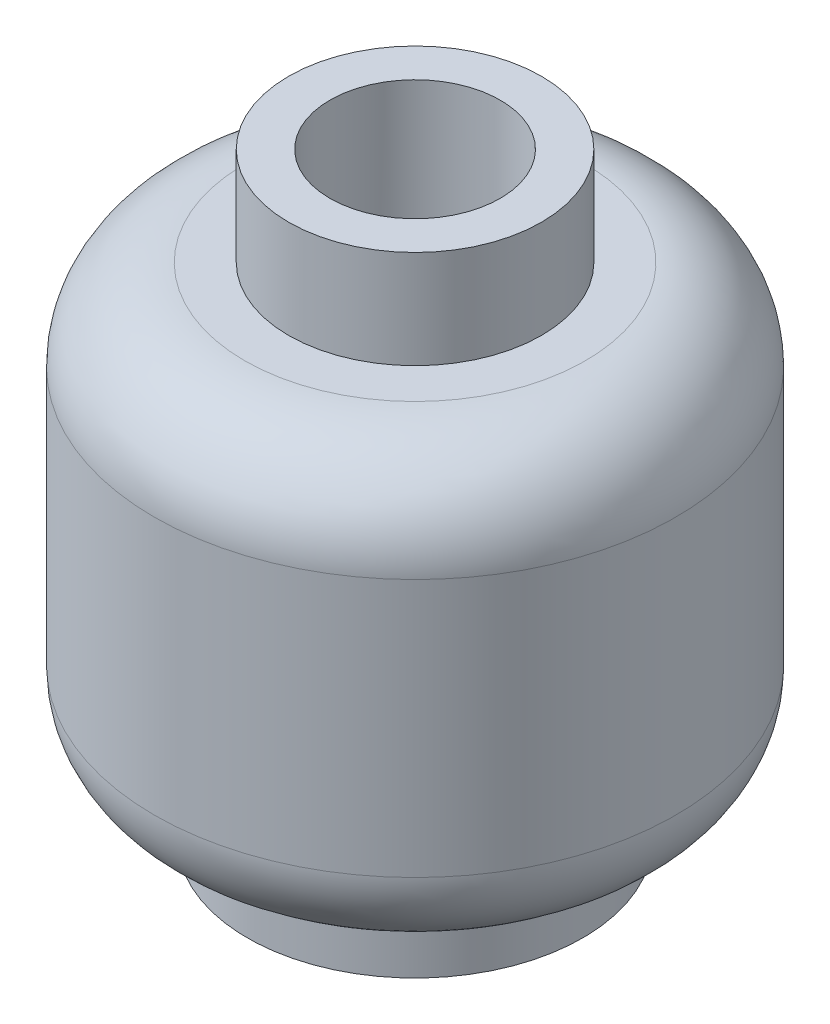
ISO-10303-21;
HEADER;
FILE_DESCRIPTION(('STEP AP214'),'2;1');
FILE_NAME('part.step','',(''),(''),'','','');
FILE_SCHEMA(('AUTOMOTIVE_DESIGN { 1 0 10303 214 1 1 1 1 }'));
ENDSEC;
DATA;
#1=APPLICATION_CONTEXT('core data for automotive mechanical design processes');
#2=APPLICATION_PROTOCOL_DEFINITION('international standard','automotive_design',2000,#1);
#3=PRODUCT_CONTEXT('',#1,'mechanical');
#4=PRODUCT('Part','Part','',(#3));
#5=PRODUCT_RELATED_PRODUCT_CATEGORY('part','',(#4));
#6=PRODUCT_DEFINITION_FORMATION('','',#4);
#7=PRODUCT_DEFINITION_CONTEXT('part definition',#1,'design');
#8=PRODUCT_DEFINITION('design','',#6,#7);
#9=PRODUCT_DEFINITION_SHAPE('','',#8);
#10=(LENGTH_UNIT() NAMED_UNIT(*) SI_UNIT(.MILLI.,.METRE.));
#11=(NAMED_UNIT(*) PLANE_ANGLE_UNIT() SI_UNIT($,.RADIAN.));
#12=(NAMED_UNIT(*) SI_UNIT($,.STERADIAN.) SOLID_ANGLE_UNIT());
#13=UNCERTAINTY_MEASURE_WITH_UNIT(LENGTH_MEASURE(1.E-05),#10,'distance_accuracy_value','');
#14=(GEOMETRIC_REPRESENTATION_CONTEXT(3) GLOBAL_UNCERTAINTY_ASSIGNED_CONTEXT((#13)) GLOBAL_UNIT_ASSIGNED_CONTEXT((#10,
#11,#12)) REPRESENTATION_CONTEXT('',''));
#15=CARTESIAN_POINT('',(0.,0.,0.));
#16=DIRECTION('',(0.,0.,1.));
#17=DIRECTION('',(1.,0.,0.));
#18=AXIS2_PLACEMENT_3D('',#15,#16,#17);
#19=CARTESIAN_POINT('',(0.,0.,0.));
#20=DIRECTION('',(0.,1.,0.));
#21=DIRECTION('',(0.,0.,1.));
#22=AXIS2_PLACEMENT_3D('',#19,#20,#21);
#23=CYLINDRICAL_SURFACE('',#22,1.65);
#24=CARTESIAN_POINT('',(0.,11.61,0.));
#25=DIRECTION('',(0.,1.,0.));
#26=DIRECTION('',(0.,0.,1.));
#27=AXIS2_PLACEMENT_3D('',#24,#25,#26);
#28=CIRCLE('',#27,1.65);
#29=CARTESIAN_POINT('',(0.,11.61,1.65));
#30=VERTEX_POINT('',#29);
#31=EDGE_CURVE('E76',#30,#30,#28,.T.);
#32=ORIENTED_EDGE('',*,*,#31,.T.);
#33=EDGE_LOOP('',(#32));
#34=FACE_BOUND('',#33,.T.);
#35=CARTESIAN_POINT('',(0.,8.6,0.));
#36=DIRECTION('',(0.,-1.,0.));
#37=DIRECTION('',(0.,0.,-1.));
#38=AXIS2_PLACEMENT_3D('',#35,#36,#37);
#39=CIRCLE('',#38,1.65);
#40=CARTESIAN_POINT('',(0.,8.6,-1.65));
#41=VERTEX_POINT('',#40);
#42=EDGE_CURVE('E48',#41,#41,#39,.F.);
#43=ORIENTED_EDGE('',*,*,#42,.F.);
#44=EDGE_LOOP('',(#43));
#45=FACE_BOUND('',#44,.T.);
#46=ADVANCED_FACE('F44',(#34,#45),#23,.F.);
#47=CARTESIAN_POINT('',(0.,1.21,0.));
#48=DIRECTION('',(0.,-1.,0.));
#49=DIRECTION('',(0.,0.,-1.));
#50=AXIS2_PLACEMENT_3D('',#47,#48,#49);
#51=CYLINDRICAL_SURFACE('',#50,3.25);
#52=CARTESIAN_POINT('',(0.,1.21,0.));
#53=DIRECTION('',(0.,1.,0.));
#54=DIRECTION('',(0.,0.,1.));
#55=AXIS2_PLACEMENT_3D('',#52,#53,#54);
#56=CIRCLE('',#55,3.25);
#57=CARTESIAN_POINT('',(0.,1.21,-3.25));
#58=VERTEX_POINT('',#57);
#59=EDGE_CURVE('E68',#58,#58,#56,.T.);
#60=CARTESIAN_POINT('',(0.,0.,0.));
#61=DIRECTION('',(0.,1.,0.));
#62=DIRECTION('',(0.,0.,1.));
#63=AXIS2_PLACEMENT_3D('',#60,#61,#62);
#64=CIRCLE('',#63,3.25);
#65=CARTESIAN_POINT('',(0.,0.,-3.25));
#66=VERTEX_POINT('',#65);
#67=EDGE_CURVE('E65',#66,#66,#64,.T.);
#68=CARTESIAN_POINT('',(0.,1.21,-3.25));
#69=CARTESIAN_POINT('',(0.,1.19739583333333,-3.25));
#70=CARTESIAN_POINT('',(0.,1.18479166666667,-3.25));
#71=CARTESIAN_POINT('',(0.,1.15958333333333,-3.25));
#72=CARTESIAN_POINT('',(0.,1.14697916666667,-3.25));
#73=CARTESIAN_POINT('',(0.,1.12177083333333,-3.25));
#74=CARTESIAN_POINT('',(0.,1.10916666666667,-3.25));
#75=CARTESIAN_POINT('',(0.,1.08395833333333,-3.25));
#76=CARTESIAN_POINT('',(0.,1.07135416666667,-3.25));
#77=CARTESIAN_POINT('',(0.,1.04614583333333,-3.25));
#78=CARTESIAN_POINT('',(0.,1.03354166666667,-3.25));
#79=CARTESIAN_POINT('',(0.,1.00833333333333,-3.25));
#80=CARTESIAN_POINT('',(0.,0.995729166666666,-3.25));
#81=CARTESIAN_POINT('',(0.,0.970520833333333,-3.25));
#82=CARTESIAN_POINT('',(0.,0.957916666666667,-3.25));
#83=CARTESIAN_POINT('',(0.,0.932708333333333,-3.25));
#84=CARTESIAN_POINT('',(0.,0.920104166666667,-3.25));
#85=CARTESIAN_POINT('',(0.,0.894895833333333,-3.25));
#86=CARTESIAN_POINT('',(0.,0.882291666666667,-3.25));
#87=CARTESIAN_POINT('',(0.,0.857083333333333,-3.25));
#88=CARTESIAN_POINT('',(0.,0.844479166666666,-3.25));
#89=CARTESIAN_POINT('',(0.,0.819270833333333,-3.25));
#90=CARTESIAN_POINT('',(0.,0.806666666666666,-3.25));
#91=CARTESIAN_POINT('',(0.,0.781458333333333,-3.25));
#92=CARTESIAN_POINT('',(0.,0.768854166666667,-3.25));
#93=CARTESIAN_POINT('',(0.,0.743645833333333,-3.25));
#94=CARTESIAN_POINT('',(0.,0.731041666666666,-3.25));
#95=CARTESIAN_POINT('',(0.,0.705833333333333,-3.25));
#96=CARTESIAN_POINT('',(0.,0.693229166666667,-3.25));
#97=CARTESIAN_POINT('',(0.,0.668020833333333,-3.25));
#98=CARTESIAN_POINT('',(0.,0.655416666666666,-3.25));
#99=CARTESIAN_POINT('',(0.,0.630208333333333,-3.25));
#100=CARTESIAN_POINT('',(0.,0.617604166666667,-3.25));
#101=CARTESIAN_POINT('',(0.,0.592395833333333,-3.25));
#102=CARTESIAN_POINT('',(0.,0.579791666666666,-3.25));
#103=CARTESIAN_POINT('',(0.,0.554583333333333,-3.25));
#104=CARTESIAN_POINT('',(0.,0.541979166666667,-3.25));
#105=CARTESIAN_POINT('',(0.,0.516770833333333,-3.25));
#106=CARTESIAN_POINT('',(0.,0.504166666666667,-3.25));
#107=CARTESIAN_POINT('',(0.,0.478958333333333,-3.25));
#108=CARTESIAN_POINT('',(0.,0.466354166666667,-3.25));
#109=CARTESIAN_POINT('',(0.,0.441145833333333,-3.25));
#110=CARTESIAN_POINT('',(0.,0.428541666666667,-3.25));
#111=CARTESIAN_POINT('',(0.,0.403333333333333,-3.25));
#112=CARTESIAN_POINT('',(0.,0.390729166666666,-3.25));
#113=CARTESIAN_POINT('',(0.,0.365520833333333,-3.25));
#114=CARTESIAN_POINT('',(0.,0.352916666666666,-3.25));
#115=CARTESIAN_POINT('',(0.,0.327708333333333,-3.25));
#116=CARTESIAN_POINT('',(0.,0.315104166666667,-3.25));
#117=CARTESIAN_POINT('',(0.,0.289895833333333,-3.25));
#118=CARTESIAN_POINT('',(0.,0.277291666666666,-3.25));
#119=CARTESIAN_POINT('',(0.,0.252083333333333,-3.25));
#120=CARTESIAN_POINT('',(0.,0.239479166666667,-3.25));
#121=CARTESIAN_POINT('',(0.,0.214270833333333,-3.25));
#122=CARTESIAN_POINT('',(0.,0.201666666666667,-3.25));
#123=CARTESIAN_POINT('',(0.,0.176458333333333,-3.25));
#124=CARTESIAN_POINT('',(0.,0.163854166666667,-3.25));
#125=CARTESIAN_POINT('',(0.,0.138645833333333,-3.25));
#126=CARTESIAN_POINT('',(0.,0.126041666666667,-3.25));
#127=CARTESIAN_POINT('',(0.,0.100833333333333,-3.25));
#128=CARTESIAN_POINT('',(0.,0.0882291666666667,-3.25));
#129=CARTESIAN_POINT('',(0.,0.0630208333333333,-3.25));
#130=CARTESIAN_POINT('',(0.,0.0504166666666667,-3.25));
#131=CARTESIAN_POINT('',(0.,0.0252083333333334,-3.25));
#132=CARTESIAN_POINT('',(0.,0.0126041666666667,-3.25));
#133=CARTESIAN_POINT('',(0.,0.,-3.25));
#134=B_SPLINE_CURVE_WITH_KNOTS('',3,(#68,#69,#70,#71,#72,#73,#74,#75,#76,#77,#78,#79,#80,#81,
#82,#83,#84,#85,#86,#87,#88,#89,#90,#91,#92,#93,#94,#95,#96,#97,#98,#99,#100,#101,#102,#103,
#104,#105,#106,#107,#108,#109,#110,#111,#112,#113,#114,#115,#116,#117,#118,#119,#120,#121,#122,
#123,#124,#125,#126,#127,#128,#129,#130,#131,#132,#133),.UNSPECIFIED.,.F.,.F.,(4,2,2,2,2,2,2,2,
2,2,2,2,2,2,2,2,2,2,2,2,2,2,2,2,2,2,2,2,2,2,2,2,4),(0.,0.0378125000000001,0.0756250000000002,
0.1134375,0.15125,0.1890625,0.226875,0.2646875,0.3025,0.3403125,0.378125,0.4159375,0.45375,
0.4915625,0.529375,0.5671875,0.605,0.6428125,0.680625,0.7184375,0.75625,0.7940625,0.831875,
0.8696875,0.9075,0.9453125,0.983125,1.0209375,1.05875,1.0965625,1.134375,1.1721875,1.21),.UNSPECIFIED.);
#135=EDGE_CURVE('BSEAM92',#58,#66,#134,.T.);
#136=ORIENTED_EDGE('',*,*,#59,.F.);
#137=ORIENTED_EDGE('',*,*,#67,.T.);
#138=ORIENTED_EDGE('',*,*,#135,.T.);
#139=ORIENTED_EDGE('',*,*,#135,.F.);
#140=EDGE_LOOP('',(#136,#138,#137,#139));
#141=FACE_BOUND('',#140,.T.);
#142=ADVANCED_FACE('F92',(#141),#51,.T.);
#143=CARTESIAN_POINT('',(0.,0.,0.));
#144=DIRECTION('',(0.,1.,0.));
#145=DIRECTION('',(0.,0.,1.));
#146=AXIS2_PLACEMENT_3D('',#143,#144,#145);
#147=PLANE('',#146);
#148=CARTESIAN_POINT('',(0.,0.,0.));
#149=DIRECTION('',(0.,-1.,0.));
#150=DIRECTION('',(0.,0.,-1.));
#151=AXIS2_PLACEMENT_3D('',#148,#149,#150);
#152=CIRCLE('',#151,2.45);
#153=CARTESIAN_POINT('',(0.,0.,-2.45));
#154=VERTEX_POINT('',#153);
#155=EDGE_CURVE('E79',#154,#154,#152,.T.);
#156=ORIENTED_EDGE('',*,*,#155,.F.);
#157=EDGE_LOOP('',(#156));
#158=FACE_BOUND('',#157,.T.);
#159=ORIENTED_EDGE('',*,*,#67,.F.);
#160=EDGE_LOOP('',(#159));
#161=FACE_BOUND('',#160,.T.);
#162=ADVANCED_FACE('F98',(#158,#161),#147,.F.);
#163=CARTESIAN_POINT('',(0.,9.71,0.));
#164=DIRECTION('',(0.,-1.,0.));
#165=DIRECTION('',(0.,0.,-1.));
#166=AXIS2_PLACEMENT_3D('',#163,#164,#165);
#167=CYLINDRICAL_SURFACE('',#166,5.05);
#168=CARTESIAN_POINT('',(0.,2.96,0.));
#169=DIRECTION('',(0.,1.,0.));
#170=DIRECTION('',(0.,0.,1.));
#171=AXIS2_PLACEMENT_3D('',#168,#169,#170);
#172=CIRCLE('',#171,5.05);
#173=CARTESIAN_POINT('',(0.,2.96,5.05));
#174=VERTEX_POINT('',#173);
#175=EDGE_CURVE('E52',#174,#174,#172,.T.);
#176=ORIENTED_EDGE('',*,*,#175,.T.);
#177=EDGE_LOOP('',(#176));
#178=FACE_BOUND('',#177,.T.);
#179=CARTESIAN_POINT('',(0.,7.96,0.));
#180=DIRECTION('',(0.,1.,0.));
#181=DIRECTION('',(0.,0.,1.));
#182=AXIS2_PLACEMENT_3D('',#179,#180,#181);
#183=CIRCLE('',#182,5.05);
#184=CARTESIAN_POINT('',(0.,7.96,5.05));
#185=VERTEX_POINT('',#184);
#186=EDGE_CURVE('E56',#185,#185,#183,.F.);
#187=ORIENTED_EDGE('',*,*,#186,.T.);
#188=EDGE_LOOP('',(#187));
#189=FACE_BOUND('',#188,.T.);
#190=ADVANCED_FACE('F118',(#178,#189),#167,.T.);
#191=CARTESIAN_POINT('',(0.,9.71,0.));
#192=DIRECTION('',(0.,1.,0.));
#193=DIRECTION('',(0.,0.,1.));
#194=AXIS2_PLACEMENT_3D('',#191,#192,#193);
#195=PLANE('',#194);
#196=CARTESIAN_POINT('',(0.,9.71,0.));
#197=DIRECTION('',(0.,1.,0.));
#198=DIRECTION('',(0.,0.,1.));
#199=AXIS2_PLACEMENT_3D('',#196,#197,#198);
#200=CIRCLE('',#199,3.3);
#201=CARTESIAN_POINT('',(0.,9.71,3.3));
#202=VERTEX_POINT('',#201);
#203=EDGE_CURVE('E61',#202,#202,#200,.T.);
#204=ORIENTED_EDGE('',*,*,#203,.T.);
#205=EDGE_LOOP('',(#204));
#206=FACE_BOUND('',#205,.T.);
#207=CARTESIAN_POINT('',(0.,9.71,0.));
#208=DIRECTION('',(0.,1.,0.));
#209=DIRECTION('',(0.,0.,1.));
#210=AXIS2_PLACEMENT_3D('',#207,#208,#209);
#211=CIRCLE('',#210,2.45);
#212=CARTESIAN_POINT('',(0.,9.71,-2.45));
#213=VERTEX_POINT('',#212);
#214=EDGE_CURVE('E64',#213,#213,#211,.T.);
#215=ORIENTED_EDGE('',*,*,#214,.F.);
#216=EDGE_LOOP('',(#215));
#217=FACE_BOUND('',#216,.T.);
#218=ADVANCED_FACE('F115',(#206,#217),#195,.T.);
#219=CARTESIAN_POINT('',(0.,1.21,0.));
#220=DIRECTION('',(0.,1.,0.));
#221=DIRECTION('',(0.,0.,1.));
#222=AXIS2_PLACEMENT_3D('',#219,#220,#221);
#223=PLANE('',#222);
#224=CARTESIAN_POINT('',(0.,1.21,0.));
#225=DIRECTION('',(0.,1.,0.));
#226=DIRECTION('',(0.,0.,1.));
#227=AXIS2_PLACEMENT_3D('',#224,#225,#226);
#228=CIRCLE('',#227,3.3);
#229=CARTESIAN_POINT('',(0.,1.21,3.3));
#230=VERTEX_POINT('',#229);
#231=EDGE_CURVE('E12',#230,#230,#228,.F.);
#232=ORIENTED_EDGE('',*,*,#231,.T.);
#233=EDGE_LOOP('',(#232));
#234=FACE_BOUND('',#233,.T.);
#235=ORIENTED_EDGE('',*,*,#59,.T.);
#236=EDGE_LOOP('',(#235));
#237=FACE_BOUND('',#236,.T.);
#238=ADVANCED_FACE('F113',(#234,#237),#223,.F.);
#239=CARTESIAN_POINT('',(0.,11.61,0.));
#240=DIRECTION('',(0.,-1.,0.));
#241=DIRECTION('',(0.,0.,-1.));
#242=AXIS2_PLACEMENT_3D('',#239,#240,#241);
#243=CYLINDRICAL_SURFACE('',#242,2.45);
#244=CARTESIAN_POINT('',(0.,11.61,0.));
#245=DIRECTION('',(0.,1.,0.));
#246=DIRECTION('',(0.,0.,1.));
#247=AXIS2_PLACEMENT_3D('',#244,#245,#246);
#248=CIRCLE('',#247,2.45);
#249=CARTESIAN_POINT('',(0.,11.61,-2.45));
#250=VERTEX_POINT('',#249);
#251=EDGE_CURVE('E69',#250,#250,#248,.T.);
#252=CARTESIAN_POINT('',(0.,11.61,-2.45));
#253=CARTESIAN_POINT('',(0.,11.5902083333333,-2.45));
#254=CARTESIAN_POINT('',(0.,11.5704166666667,-2.45));
#255=CARTESIAN_POINT('',(0.,11.5308333333333,-2.45));
#256=CARTESIAN_POINT('',(0.,11.5110416666667,-2.45));
#257=CARTESIAN_POINT('',(0.,11.4714583333333,-2.45));
#258=CARTESIAN_POINT('',(0.,11.4516666666667,-2.45));
#259=CARTESIAN_POINT('',(0.,11.4120833333333,-2.45));
#260=CARTESIAN_POINT('',(0.,11.3922916666667,-2.45));
#261=CARTESIAN_POINT('',(0.,11.3527083333333,-2.45));
#262=CARTESIAN_POINT('',(0.,11.3329166666667,-2.45));
#263=CARTESIAN_POINT('',(0.,11.2933333333333,-2.45));
#264=CARTESIAN_POINT('',(0.,11.2735416666667,-2.45));
#265=CARTESIAN_POINT('',(0.,11.2339583333333,-2.45));
#266=CARTESIAN_POINT('',(0.,11.2141666666667,-2.45));
#267=CARTESIAN_POINT('',(0.,11.1745833333333,-2.45));
#268=CARTESIAN_POINT('',(0.,11.1547916666667,-2.45));
#269=CARTESIAN_POINT('',(0.,11.1152083333333,-2.45));
#270=CARTESIAN_POINT('',(0.,11.0954166666667,-2.45));
#271=CARTESIAN_POINT('',(0.,11.0558333333333,-2.45));
#272=CARTESIAN_POINT('',(0.,11.0360416666667,-2.45));
#273=CARTESIAN_POINT('',(0.,10.9964583333333,-2.45));
#274=CARTESIAN_POINT('',(0.,10.9766666666667,-2.45));
#275=CARTESIAN_POINT('',(0.,10.9370833333333,-2.45));
#276=CARTESIAN_POINT('',(0.,10.9172916666667,-2.45));
#277=CARTESIAN_POINT('',(0.,10.8777083333333,-2.45));
#278=CARTESIAN_POINT('',(0.,10.8579166666667,-2.45));
#279=CARTESIAN_POINT('',(0.,10.8183333333333,-2.45));
#280=CARTESIAN_POINT('',(0.,10.7985416666667,-2.45));
#281=CARTESIAN_POINT('',(0.,10.7589583333333,-2.45));
#282=CARTESIAN_POINT('',(0.,10.7391666666667,-2.45));
#283=CARTESIAN_POINT('',(0.,10.6995833333333,-2.45));
#284=CARTESIAN_POINT('',(0.,10.6797916666667,-2.45));
#285=CARTESIAN_POINT('',(0.,10.6402083333333,-2.45));
#286=CARTESIAN_POINT('',(0.,10.6204166666667,-2.45));
#287=CARTESIAN_POINT('',(0.,10.5808333333333,-2.45));
#288=CARTESIAN_POINT('',(0.,10.5610416666667,-2.45));
#289=CARTESIAN_POINT('',(0.,10.5214583333333,-2.45));
#290=CARTESIAN_POINT('',(0.,10.5016666666667,-2.45));
#291=CARTESIAN_POINT('',(0.,10.4620833333333,-2.45));
#292=CARTESIAN_POINT('',(0.,10.4422916666667,-2.45));
#293=CARTESIAN_POINT('',(0.,10.4027083333333,-2.45));
#294=CARTESIAN_POINT('',(0.,10.3829166666667,-2.45));
#295=CARTESIAN_POINT('',(0.,10.3433333333333,-2.45));
#296=CARTESIAN_POINT('',(0.,10.3235416666667,-2.45));
#297=CARTESIAN_POINT('',(0.,10.2839583333333,-2.45));
#298=CARTESIAN_POINT('',(0.,10.2641666666667,-2.45));
#299=CARTESIAN_POINT('',(0.,10.2245833333333,-2.45));
#300=CARTESIAN_POINT('',(0.,10.2047916666667,-2.45));
#301=CARTESIAN_POINT('',(0.,10.1652083333333,-2.45));
#302=CARTESIAN_POINT('',(0.,10.1454166666667,-2.45));
#303=CARTESIAN_POINT('',(0.,10.1058333333333,-2.45));
#304=CARTESIAN_POINT('',(0.,10.0860416666667,-2.45));
#305=CARTESIAN_POINT('',(0.,10.0464583333333,-2.45));
#306=CARTESIAN_POINT('',(0.,10.0266666666667,-2.45));
#307=CARTESIAN_POINT('',(0.,9.98708333333333,-2.45));
#308=CARTESIAN_POINT('',(0.,9.96729166666666,-2.45));
#309=CARTESIAN_POINT('',(0.,9.92770833333333,-2.45));
#310=CARTESIAN_POINT('',(0.,9.90791666666667,-2.45));
#311=CARTESIAN_POINT('',(0.,9.86833333333333,-2.45));
#312=CARTESIAN_POINT('',(0.,9.84854166666667,-2.45));
#313=CARTESIAN_POINT('',(0.,9.80895833333333,-2.45));
#314=CARTESIAN_POINT('',(0.,9.78916666666666,-2.45));
#315=CARTESIAN_POINT('',(0.,9.74958333333333,-2.45));
#316=CARTESIAN_POINT('',(0.,9.72979166666666,-2.45));
#317=CARTESIAN_POINT('',(0.,9.71,-2.45));
#318=B_SPLINE_CURVE_WITH_KNOTS('',3,(#252,#253,#254,#255,#256,#257,#258,#259,#260,#261,#262,
#263,#264,#265,#266,#267,#268,#269,#270,#271,#272,#273,#274,#275,#276,#277,#278,#279,#280,#281,
#282,#283,#284,#285,#286,#287,#288,#289,#290,#291,#292,#293,#294,#295,#296,#297,#298,#299,#300,
#301,#302,#303,#304,#305,#306,#307,#308,#309,#310,#311,#312,#313,#314,#315,#316,#317),
.UNSPECIFIED.,.F.,.F.,(4,2,2,2,2,2,2,2,2,2,2,2,2,2,2,2,2,2,2,2,2,2,2,2,2,2,2,2,2,2,2,2,4),(0.,
0.0593749999999987,0.118749999999999,0.178124999999999,0.2375,0.296874999999999,
0.356249999999999,0.415624999999999,0.475,0.534374999999998,0.593749999999999,0.653124999999999,
0.7125,0.771874999999998,0.831249999999999,0.890624999999999,0.95,1.009375,1.06875,1.128125,
1.1875,1.246875,1.30625,1.365625,1.425,1.484375,1.54375,1.603125,1.6625,1.721875,1.78125,
1.840625,1.9),.UNSPECIFIED.);
#319=EDGE_CURVE('BSEAM109',#250,#213,#318,.T.);
#320=ORIENTED_EDGE('',*,*,#251,.F.);
#321=ORIENTED_EDGE('',*,*,#214,.T.);
#322=ORIENTED_EDGE('',*,*,#319,.T.);
#323=ORIENTED_EDGE('',*,*,#319,.F.);
#324=EDGE_LOOP('',(#320,#322,#321,#323));
#325=FACE_BOUND('',#324,.T.);
#326=ADVANCED_FACE('F109',(#325),#243,.T.);
#327=CARTESIAN_POINT('',(0.,11.61,0.));
#328=DIRECTION('',(0.,1.,0.));
#329=DIRECTION('',(0.,0.,1.));
#330=AXIS2_PLACEMENT_3D('',#327,#328,#329);
#331=PLANE('',#330);
#332=ORIENTED_EDGE('',*,*,#31,.F.);
#333=EDGE_LOOP('',(#332));
#334=FACE_BOUND('',#333,.T.);
#335=ORIENTED_EDGE('',*,*,#251,.T.);
#336=EDGE_LOOP('',(#335));
#337=FACE_BOUND('',#336,.T.);
#338=ADVANCED_FACE('F105',(#334,#337),#331,.T.);
#339=CARTESIAN_POINT('',(0.,7.96,0.));
#340=DIRECTION('',(0.,1.,0.));
#341=DIRECTION('',(0.,0.,1.));
#342=AXIS2_PLACEMENT_3D('',#339,#340,#341);
#343=TOROIDAL_SURFACE('',#342,3.3,1.75);
#344=ORIENTED_EDGE('',*,*,#186,.F.);
#345=EDGE_LOOP('',(#344));
#346=FACE_BOUND('',#345,.T.);
#347=ORIENTED_EDGE('',*,*,#203,.F.);
#348=EDGE_LOOP('',(#347));
#349=FACE_BOUND('',#348,.T.);
#350=ADVANCED_FACE('F108',(#346,#349),#343,.T.);
#351=CARTESIAN_POINT('',(0.,2.96,0.));
#352=DIRECTION('',(0.,1.,0.));
#353=DIRECTION('',(0.,0.,1.));
#354=AXIS2_PLACEMENT_3D('',#351,#352,#353);
#355=TOROIDAL_SURFACE('',#354,3.3,1.75);
#356=ORIENTED_EDGE('',*,*,#231,.F.);
#357=EDGE_LOOP('',(#356));
#358=FACE_BOUND('',#357,.T.);
#359=ORIENTED_EDGE('',*,*,#175,.F.);
#360=EDGE_LOOP('',(#359));
#361=FACE_BOUND('',#360,.T.);
#362=ADVANCED_FACE('F46',(#358,#361),#355,.T.);
#363=CARTESIAN_POINT('',(0.,8.6,0.));
#364=DIRECTION('',(0.,-1.,0.));
#365=DIRECTION('',(0.,0.,-1.));
#366=AXIS2_PLACEMENT_3D('',#363,#364,#365);
#367=PLANE('',#366);
#368=CARTESIAN_POINT('',(0.,8.6,0.));
#369=DIRECTION('',(0.,-1.,0.));
#370=DIRECTION('',(0.,0.,-1.));
#371=AXIS2_PLACEMENT_3D('',#368,#369,#370);
#372=CIRCLE('',#371,2.45);
#373=CARTESIAN_POINT('',(0.,8.6,-2.45));
#374=VERTEX_POINT('',#373);
#375=EDGE_CURVE('E82',#374,#374,#372,.T.);
#376=ORIENTED_EDGE('',*,*,#375,.T.);
#377=EDGE_LOOP('',(#376));
#378=FACE_BOUND('',#377,.T.);
#379=ORIENTED_EDGE('',*,*,#42,.T.);
#380=EDGE_LOOP('',(#379));
#381=FACE_BOUND('',#380,.T.);
#382=ADVANCED_FACE('F89',(#378,#381),#367,.T.);
#383=CARTESIAN_POINT('',(0.,8.6,0.));
#384=DIRECTION('',(0.,-1.,0.));
#385=DIRECTION('',(0.,0.,-1.));
#386=AXIS2_PLACEMENT_3D('',#383,#384,#385);
#387=CYLINDRICAL_SURFACE('',#386,2.45);
#388=CARTESIAN_POINT('',(0.,8.6,-2.45));
#389=CARTESIAN_POINT('',(0.,8.51041666666667,-2.45));
#390=CARTESIAN_POINT('',(0.,8.42083333333333,-2.45));
#391=CARTESIAN_POINT('',(0.,8.24166666666667,-2.45));
#392=CARTESIAN_POINT('',(0.,8.15208333333333,-2.45));
#393=CARTESIAN_POINT('',(0.,7.97291666666667,-2.45));
#394=CARTESIAN_POINT('',(0.,7.88333333333333,-2.45));
#395=CARTESIAN_POINT('',(0.,7.70416666666667,-2.45));
#396=CARTESIAN_POINT('',(0.,7.61458333333333,-2.45));
#397=CARTESIAN_POINT('',(0.,7.43541666666667,-2.45));
#398=CARTESIAN_POINT('',(0.,7.34583333333333,-2.45));
#399=CARTESIAN_POINT('',(0.,7.16666666666667,-2.45));
#400=CARTESIAN_POINT('',(0.,7.07708333333333,-2.45));
#401=CARTESIAN_POINT('',(0.,6.89791666666667,-2.45));
#402=CARTESIAN_POINT('',(0.,6.80833333333333,-2.45));
#403=CARTESIAN_POINT('',(0.,6.62916666666667,-2.45));
#404=CARTESIAN_POINT('',(0.,6.53958333333333,-2.45));
#405=CARTESIAN_POINT('',(0.,6.36041666666667,-2.45));
#406=CARTESIAN_POINT('',(0.,6.27083333333333,-2.45));
#407=CARTESIAN_POINT('',(0.,6.09166666666667,-2.45));
#408=CARTESIAN_POINT('',(0.,6.00208333333333,-2.45));
#409=CARTESIAN_POINT('',(0.,5.82291666666667,-2.45));
#410=CARTESIAN_POINT('',(0.,5.73333333333333,-2.45));
#411=CARTESIAN_POINT('',(0.,5.55416666666667,-2.45));
#412=CARTESIAN_POINT('',(0.,5.46458333333333,-2.45));
#413=CARTESIAN_POINT('',(0.,5.28541666666667,-2.45));
#414=CARTESIAN_POINT('',(0.,5.19583333333333,-2.45));
#415=CARTESIAN_POINT('',(0.,5.01666666666667,-2.45));
#416=CARTESIAN_POINT('',(0.,4.92708333333333,-2.45));
#417=CARTESIAN_POINT('',(0.,4.74791666666667,-2.45));
#418=CARTESIAN_POINT('',(0.,4.65833333333333,-2.45));
#419=CARTESIAN_POINT('',(0.,4.47916666666667,-2.45));
#420=CARTESIAN_POINT('',(0.,4.38958333333333,-2.45));
#421=CARTESIAN_POINT('',(0.,4.21041666666667,-2.45));
#422=CARTESIAN_POINT('',(0.,4.12083333333333,-2.45));
#423=CARTESIAN_POINT('',(0.,3.94166666666667,-2.45));
#424=CARTESIAN_POINT('',(0.,3.85208333333333,-2.45));
#425=CARTESIAN_POINT('',(0.,3.67291666666667,-2.45));
#426=CARTESIAN_POINT('',(0.,3.58333333333333,-2.45));
#427=CARTESIAN_POINT('',(0.,3.40416666666667,-2.45));
#428=CARTESIAN_POINT('',(0.,3.31458333333333,-2.45));
#429=CARTESIAN_POINT('',(0.,3.13541666666667,-2.45));
#430=CARTESIAN_POINT('',(0.,3.04583333333333,-2.45));
#431=CARTESIAN_POINT('',(0.,2.86666666666667,-2.45));
#432=CARTESIAN_POINT('',(0.,2.77708333333333,-2.45));
#433=CARTESIAN_POINT('',(0.,2.59791666666667,-2.45));
#434=CARTESIAN_POINT('',(0.,2.50833333333333,-2.45));
#435=CARTESIAN_POINT('',(0.,2.32916666666667,-2.45));
#436=CARTESIAN_POINT('',(0.,2.23958333333333,-2.45));
#437=CARTESIAN_POINT('',(0.,2.06041666666667,-2.45));
#438=CARTESIAN_POINT('',(0.,1.97083333333333,-2.45));
#439=CARTESIAN_POINT('',(0.,1.79166666666667,-2.45));
#440=CARTESIAN_POINT('',(0.,1.70208333333333,-2.45));
#441=CARTESIAN_POINT('',(0.,1.52291666666667,-2.45));
#442=CARTESIAN_POINT('',(0.,1.43333333333333,-2.45));
#443=CARTESIAN_POINT('',(0.,1.25416666666667,-2.45));
#444=CARTESIAN_POINT('',(0.,1.16458333333333,-2.45));
#445=CARTESIAN_POINT('',(0.,0.985416666666667,-2.45));
#446=CARTESIAN_POINT('',(0.,0.895833333333334,-2.45));
#447=CARTESIAN_POINT('',(0.,0.716666666666668,-2.45));
#448=CARTESIAN_POINT('',(0.,0.627083333333335,-2.45));
#449=CARTESIAN_POINT('',(0.,0.447916666666668,-2.45));
#450=CARTESIAN_POINT('',(0.,0.358333333333335,-2.45));
#451=CARTESIAN_POINT('',(0.,0.179166666666668,-2.45));
#452=CARTESIAN_POINT('',(0.,0.0895833333333351,-2.45));
#453=CARTESIAN_POINT('',(0.,0.,-2.45));
#454=B_SPLINE_CURVE_WITH_KNOTS('',3,(#388,#389,#390,#391,#392,#393,#394,#395,#396,#397,#398,
#399,#400,#401,#402,#403,#404,#405,#406,#407,#408,#409,#410,#411,#412,#413,#414,#415,#416,#417,
#418,#419,#420,#421,#422,#423,#424,#425,#426,#427,#428,#429,#430,#431,#432,#433,#434,#435,#436,
#437,#438,#439,#440,#441,#442,#443,#444,#445,#446,#447,#448,#449,#450,#451,#452,#453),
.UNSPECIFIED.,.F.,.F.,(4,2,2,2,2,2,2,2,2,2,2,2,2,2,2,2,2,2,2,2,2,2,2,2,2,2,2,2,2,2,2,2,4),(0.,
0.268750000000002,0.537500000000002,0.806250000000001,1.075,1.34375,1.6125,1.88125,2.15,2.41875,
2.6875,2.95625,3.225,3.49375,3.7625,4.03125,4.3,4.56875,4.8375,5.10625,5.375,5.64375,5.9125,
6.18125,6.45,6.71875,6.9875,7.25625,7.525,7.79375,8.0625,8.33125,8.6),.UNSPECIFIED.);
#455=EDGE_CURVE('BSEAM103',#374,#154,#454,.T.);
#456=ORIENTED_EDGE('',*,*,#375,.F.);
#457=ORIENTED_EDGE('',*,*,#155,.T.);
#458=ORIENTED_EDGE('',*,*,#455,.T.);
#459=ORIENTED_EDGE('',*,*,#455,.F.);
#460=EDGE_LOOP('',(#456,#458,#457,#459));
#461=FACE_BOUND('',#460,.T.);
#462=ADVANCED_FACE('F103',(#461),#387,.F.);
#463=CLOSED_SHELL('',(#46,#142,#162,#190,#218,#238,#326,#338,#350,#362,#382,#462));
#464=MANIFOLD_SOLID_BREP('B2',#463);
#465=ADVANCED_BREP_SHAPE_REPRESENTATION('',(#18,#464),#14);
#466=SHAPE_DEFINITION_REPRESENTATION(#9,#465);
ENDSEC;
END-ISO-10303-21;
